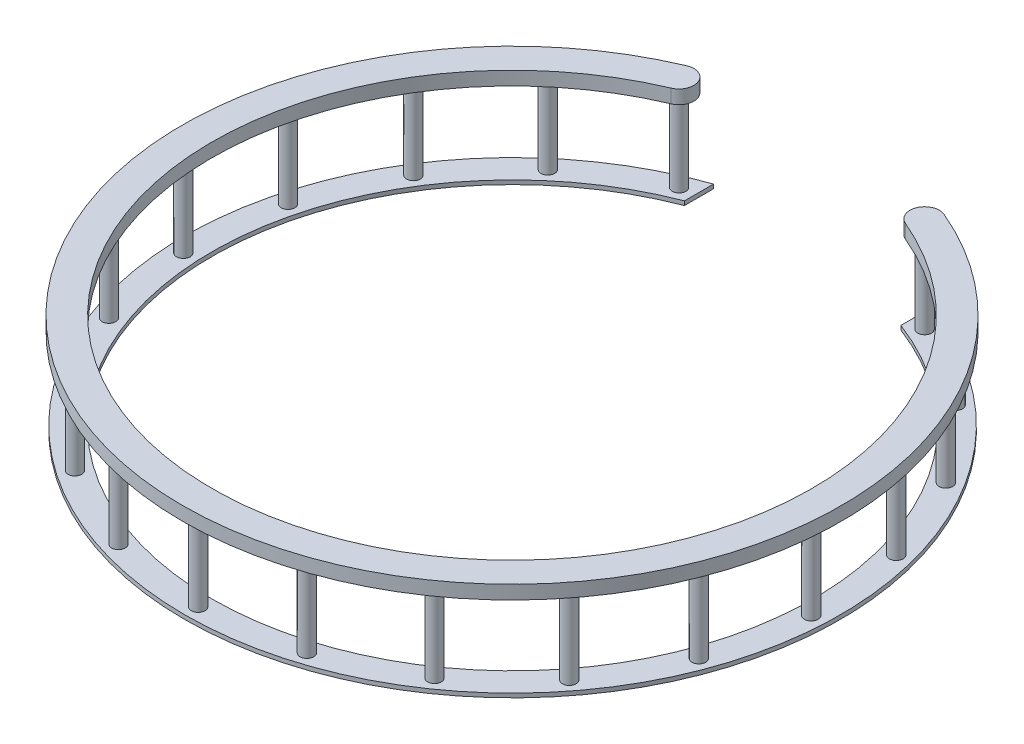
ISO-10303-21;
HEADER;
FILE_DESCRIPTION(('STEP AP214'),'2;1');
FILE_NAME('part.step','',(''),(''),'','','');
FILE_SCHEMA(('AUTOMOTIVE_DESIGN { 1 0 10303 214 1 1 1 1 }'));
ENDSEC;
DATA;
#1=APPLICATION_CONTEXT('core data for automotive mechanical design processes');
#2=APPLICATION_PROTOCOL_DEFINITION('international standard','automotive_design',2000,#1);
#3=PRODUCT_CONTEXT('',#1,'mechanical');
#4=PRODUCT('Part','Part','',(#3));
#5=PRODUCT_RELATED_PRODUCT_CATEGORY('part','',(#4));
#6=PRODUCT_DEFINITION_FORMATION('','',#4);
#7=PRODUCT_DEFINITION_CONTEXT('part definition',#1,'design');
#8=PRODUCT_DEFINITION('design','',#6,#7);
#9=PRODUCT_DEFINITION_SHAPE('','',#8);
#10=(LENGTH_UNIT() NAMED_UNIT(*) SI_UNIT(.MILLI.,.METRE.));
#11=(NAMED_UNIT(*) PLANE_ANGLE_UNIT() SI_UNIT($,.RADIAN.));
#12=(NAMED_UNIT(*) SI_UNIT($,.STERADIAN.) SOLID_ANGLE_UNIT());
#13=UNCERTAINTY_MEASURE_WITH_UNIT(LENGTH_MEASURE(1.E-05),#10,'distance_accuracy_value','');
#14=(GEOMETRIC_REPRESENTATION_CONTEXT(3) GLOBAL_UNCERTAINTY_ASSIGNED_CONTEXT((#13)) GLOBAL_UNIT_ASSIGNED_CONTEXT((#10,
#11,#12)) REPRESENTATION_CONTEXT('',''));
#15=CARTESIAN_POINT('',(0.,0.,0.));
#16=DIRECTION('',(0.,0.,1.));
#17=DIRECTION('',(1.,0.,0.));
#18=AXIS2_PLACEMENT_3D('',#15,#16,#17);
#19=CARTESIAN_POINT('',(0.,150.,0.));
#20=DIRECTION('',(0.,-1.,0.));
#21=DIRECTION('',(0.,0.,-1.));
#22=AXIS2_PLACEMENT_3D('',#19,#20,#21);
#23=CYLINDRICAL_SURFACE('',#22,12000.);
#24=CARTESIAN_POINT('',(0.,150.,0.));
#25=DIRECTION('',(0.,1.,0.));
#26=DIRECTION('',(0.,0.,1.));
#27=AXIS2_PLACEMENT_3D('',#24,#25,#26);
#28=CIRCLE('',#27,12000.);
#29=CARTESIAN_POINT('',(-3968.62696659689,150.,-11324.7516529061));
#30=VERTEX_POINT('',#29);
#31=CARTESIAN_POINT('',(3936.45053969156,150.,-11335.9762327098));
#32=VERTEX_POINT('',#31);
#33=EDGE_CURVE('E323',#30,#32,#28,.T.);
#34=ORIENTED_EDGE('',*,*,#33,.F.);
#35=DIRECTION('',(0.,-1.,0.));
#36=VECTOR('',#35,1.);
#37=CARTESIAN_POINT('',(-3968.62696659689,150.,-11324.7516529061));
#38=LINE('',#37,#36);
#39=CARTESIAN_POINT('',(-3968.62696659689,0.,-11324.7516529061));
#40=VERTEX_POINT('',#39);
#41=EDGE_CURVE('E162',#30,#40,#38,.T.);
#42=ORIENTED_EDGE('',*,*,#41,.T.);
#43=CARTESIAN_POINT('',(0.,0.,0.));
#44=DIRECTION('',(0.,1.,0.));
#45=DIRECTION('',(0.,0.,1.));
#46=AXIS2_PLACEMENT_3D('',#43,#44,#45);
#47=CIRCLE('',#46,12000.);
#48=CARTESIAN_POINT('',(3936.45053969156,0.,-11335.9762327098));
#49=VERTEX_POINT('',#48);
#50=EDGE_CURVE('E327',#40,#49,#47,.T.);
#51=ORIENTED_EDGE('',*,*,#50,.T.);
#52=DIRECTION('',(0.,-1.,0.));
#53=VECTOR('',#52,1.);
#54=CARTESIAN_POINT('',(3936.45053969156,150.,-11335.9762327098));
#55=LINE('',#54,#53);
#56=EDGE_CURVE('E152',#49,#32,#55,.F.);
#57=ORIENTED_EDGE('',*,*,#56,.T.);
#58=EDGE_LOOP('',(#34,#42,#51,#57));
#59=FACE_BOUND('',#58,.T.);
#60=ADVANCED_FACE('F49',(#59),#23,.T.);
#61=CARTESIAN_POINT('',(0.,150.,0.));
#62=DIRECTION('',(0.,1.,0.));
#63=DIRECTION('',(0.,0.,1.));
#64=AXIS2_PLACEMENT_3D('',#61,#62,#63);
#65=PLANE('',#64);
#66=DIRECTION('',(0.,0.,1.));
#67=VECTOR('',#66,1.);
#68=CARTESIAN_POINT('',(-3968.62696659689,150.,0.));
#69=LINE('',#68,#67);
#70=CARTESIAN_POINT('',(-3968.62696659689,150.,-10259.1422643416));
#71=VERTEX_POINT('',#70);
#72=EDGE_CURVE('E72',#30,#71,#69,.T.);
#73=ORIENTED_EDGE('',*,*,#72,.F.);
#74=ORIENTED_EDGE('',*,*,#33,.T.);
#75=DIRECTION('',(0.,0.,-1.));
#76=VECTOR('',#75,1.);
#77=CARTESIAN_POINT('',(3936.45053969156,150.,0.));
#78=LINE('',#77,#76);
#79=CARTESIAN_POINT('',(3936.45053969156,150.,-10271.5313925705));
#80=VERTEX_POINT('',#79);
#81=EDGE_CURVE('E144',#80,#32,#78,.T.);
#82=ORIENTED_EDGE('',*,*,#81,.F.);
#83=CARTESIAN_POINT('',(0.,150.,0.));
#84=DIRECTION('',(0.,1.,0.));
#85=DIRECTION('',(0.,0.,1.));
#86=AXIS2_PLACEMENT_3D('',#83,#84,#85);
#87=CIRCLE('',#86,11000.);
#88=EDGE_CURVE('E315',#71,#80,#87,.T.);
#89=ORIENTED_EDGE('',*,*,#88,.F.);
#90=EDGE_LOOP('',(#73,#74,#82,#89));
#91=FACE_BOUND('',#90,.T.);
#92=CARTESIAN_POINT('',(3447.48044475495,150.,10971.0928618361));
#93=DIRECTION('',(0.,1.,0.));
#94=DIRECTION('',(0.299780908239561,0.,0.954008074942274));
#95=AXIS2_PLACEMENT_3D('',#92,#93,#94);
#96=CIRCLE('',#95,250.);
#97=CARTESIAN_POINT('',(3522.42567181484,150.,11209.5948805717));
#98=VERTEX_POINT('',#97);
#99=EDGE_CURVE('E167',#98,#98,#96,.T.);
#100=ORIENTED_EDGE('',*,*,#99,.F.);
#101=EDGE_LOOP('',(#100));
#102=FACE_BOUND('',#101,.T.);
#103=CARTESIAN_POINT('',(6577.84836500361,150.,9433.02236226646));
#104=DIRECTION('',(0.,1.,0.));
#105=DIRECTION('',(0.57198681434814,0.,0.820262814110128));
#106=AXIS2_PLACEMENT_3D('',#103,#104,#105);
#107=CIRCLE('',#106,250.);
#108=CARTESIAN_POINT('',(6720.84506859064,150.,9638.088065794));
#109=VERTEX_POINT('',#108);
#110=EDGE_CURVE('E177',#109,#109,#107,.T.);
#111=ORIENTED_EDGE('',*,*,#110,.F.);
#112=EDGE_LOOP('',(#111));
#113=FACE_BOUND('',#112,.T.);
#114=CARTESIAN_POINT('',(9103.16046716361,150.,7027.26614759036));
#115=DIRECTION('',(0.,1.,0.));
#116=DIRECTION('',(0.791579171057706,0.,0.611066621529597));
#117=AXIS2_PLACEMENT_3D('',#114,#115,#116);
#118=CIRCLE('',#117,250.);
#119=CARTESIAN_POINT('',(9301.05525992804,150.,7180.03280297276));
#120=VERTEX_POINT('',#119);
#121=EDGE_CURVE('E185',#120,#120,#118,.T.);
#122=ORIENTED_EDGE('',*,*,#121,.F.);
#123=EDGE_LOOP('',(#122));
#124=FACE_BOUND('',#123,.T.);
#125=CARTESIAN_POINT('',(10791.1288213351,150.,3975.11493687292));
#126=DIRECTION('',(0.,1.,0.));
#127=DIRECTION('',(0.938359027942186,0.,0.345662168423732));
#128=AXIS2_PLACEMENT_3D('',#125,#126,#127);
#129=CIRCLE('',#128,250.);
#130=CARTESIAN_POINT('',(11025.7185783207,150.,4061.53047897885));
#131=VERTEX_POINT('',#130);
#132=EDGE_CURVE('E193',#131,#131,#129,.T.);
#133=ORIENTED_EDGE('',*,*,#132,.F.);
#134=EDGE_LOOP('',(#133));
#135=FACE_BOUND('',#134,.T.);
#136=CARTESIAN_POINT('',(11486.4875994284,150.,557.317349610463));
#137=DIRECTION('',(0.,1.,0.));
#138=DIRECTION('',(0.998825008645951,0.,0.0484623782269967));
#139=AXIS2_PLACEMENT_3D('',#136,#137,#138);
#140=CIRCLE('',#139,250.);
#141=CARTESIAN_POINT('',(11736.1938515899,150.,569.432944167212));
#142=VERTEX_POINT('',#141);
#143=EDGE_CURVE('E201',#142,#142,#140,.T.);
#144=ORIENTED_EDGE('',*,*,#143,.F.);
#145=EDGE_LOOP('',(#144));
#146=FACE_BOUND('',#145,.T.);
#147=CARTESIAN_POINT('',(11125.2750238229,150.,-2911.7444332053));
#148=DIRECTION('',(0.,1.,0.));
#149=DIRECTION('',(0.967415219462862,0.,-0.253195168104809));
#150=AXIS2_PLACEMENT_3D('',#147,#148,#149);
#151=CIRCLE('',#150,250.);
#152=CARTESIAN_POINT('',(11367.1288286886,150.,-2975.0432252315));
#153=VERTEX_POINT('',#152);
#154=EDGE_CURVE('E209',#153,#153,#151,.T.);
#155=ORIENTED_EDGE('',*,*,#154,.F.);
#156=EDGE_LOOP('',(#155));
#157=FACE_BOUND('',#156,.T.);
#158=CARTESIAN_POINT('',(9740.71681793288,150.,-6112.97275250261));
#159=DIRECTION('',(0.,1.,0.));
#160=DIRECTION('',(0.847018853733295,0.,-0.531562848043705));
#161=AXIS2_PLACEMENT_3D('',#158,#159,#160);
#162=CIRCLE('',#161,250.);
#163=CARTESIAN_POINT('',(9952.47153136621,150.,-6245.86346451353));
#164=VERTEX_POINT('',#163);
#165=EDGE_CURVE('E217',#164,#164,#162,.T.);
#166=ORIENTED_EDGE('',*,*,#165,.F.);
#167=EDGE_LOOP('',(#166));
#168=FACE_BOUND('',#167,.T.);
#169=CARTESIAN_POINT('',(7460.16997624506,150.,-8751.90630237387));
#170=DIRECTION('',(0.,1.,0.));
#171=DIRECTION('',(0.648710432716962,0.,-0.761035330641207));
#172=AXIS2_PLACEMENT_3D('',#169,#170,#171);
#173=CIRCLE('',#172,250.);
#174=CARTESIAN_POINT('',(7622.3475844243,150.,-8942.16513503418));
#175=VERTEX_POINT('',#174);
#176=EDGE_CURVE('E225',#175,#175,#173,.T.);
#177=ORIENTED_EDGE('',*,*,#176,.F.);
#178=EDGE_LOOP('',(#177));
#179=FACE_BOUND('',#178,.T.);
#180=CARTESIAN_POINT('',(4493.40797762652,150.,-10585.8058147031));
#181=DIRECTION('',(0.,1.,0.));
#182=DIRECTION('',(0.390731128489263,0.,-0.920504853452445));
#183=AXIS2_PLACEMENT_3D('',#180,#181,#182);
#184=CIRCLE('',#183,250.);
#185=CARTESIAN_POINT('',(4591.09075974884,150.,-10815.9320280662));
#186=VERTEX_POINT('',#185);
#187=EDGE_CURVE('E166',#186,#186,#184,.T.);
#188=ORIENTED_EDGE('',*,*,#187,.F.);
#189=EDGE_LOOP('',(#188));
#190=FACE_BOUND('',#189,.T.);
#191=CARTESIAN_POINT('',(-3447.48044475495,150.,10971.0928618361));
#192=DIRECTION('',(0.,1.,0.));
#193=DIRECTION('',(-0.299780908239561,0.,0.954008074942274));
#194=AXIS2_PLACEMENT_3D('',#191,#192,#193);
#195=CIRCLE('',#194,250.);
#196=CARTESIAN_POINT('',(-3522.42567181484,150.,11209.5948805717));
#197=VERTEX_POINT('',#196);
#198=EDGE_CURVE('E239',#197,#197,#195,.T.);
#199=ORIENTED_EDGE('',*,*,#198,.F.);
#200=EDGE_LOOP('',(#199));
#201=FACE_BOUND('',#200,.T.);
#202=CARTESIAN_POINT('',(-6577.84836500361,150.,9433.02236226646));
#203=DIRECTION('',(0.,1.,0.));
#204=DIRECTION('',(-0.57198681434814,0.,0.820262814110128));
#205=AXIS2_PLACEMENT_3D('',#202,#203,#204);
#206=CIRCLE('',#205,250.);
#207=CARTESIAN_POINT('',(-6720.84506859064,150.,9638.088065794));
#208=VERTEX_POINT('',#207);
#209=EDGE_CURVE('E249',#208,#208,#206,.T.);
#210=ORIENTED_EDGE('',*,*,#209,.F.);
#211=EDGE_LOOP('',(#210));
#212=FACE_BOUND('',#211,.T.);
#213=CARTESIAN_POINT('',(-9103.16046716361,150.,7027.26614759036));
#214=DIRECTION('',(0.,1.,0.));
#215=DIRECTION('',(-0.791579171057706,0.,0.611066621529597));
#216=AXIS2_PLACEMENT_3D('',#213,#214,#215);
#217=CIRCLE('',#216,250.);
#218=CARTESIAN_POINT('',(-9301.05525992804,150.,7180.03280297276));
#219=VERTEX_POINT('',#218);
#220=EDGE_CURVE('E257',#219,#219,#217,.T.);
#221=ORIENTED_EDGE('',*,*,#220,.F.);
#222=EDGE_LOOP('',(#221));
#223=FACE_BOUND('',#222,.T.);
#224=CARTESIAN_POINT('',(-10791.1288213351,150.,3975.11493687291));
#225=DIRECTION('',(0.,1.,0.));
#226=DIRECTION('',(-0.938359027942186,0.,0.345662168423732));
#227=AXIS2_PLACEMENT_3D('',#224,#225,#226);
#228=CIRCLE('',#227,250.);
#229=CARTESIAN_POINT('',(-11025.7185783207,150.,4061.53047897885));
#230=VERTEX_POINT('',#229);
#231=EDGE_CURVE('E265',#230,#230,#228,.T.);
#232=ORIENTED_EDGE('',*,*,#231,.F.);
#233=EDGE_LOOP('',(#232));
#234=FACE_BOUND('',#233,.T.);
#235=CARTESIAN_POINT('',(-11486.4875994284,150.,557.317349610461));
#236=DIRECTION('',(0.,1.,0.));
#237=DIRECTION('',(-0.998825008645951,0.,0.0484623782269967));
#238=AXIS2_PLACEMENT_3D('',#235,#236,#237);
#239=CIRCLE('',#238,250.);
#240=CARTESIAN_POINT('',(-11736.1938515899,150.,569.43294416721));
#241=VERTEX_POINT('',#240);
#242=EDGE_CURVE('E273',#241,#241,#239,.T.);
#243=ORIENTED_EDGE('',*,*,#242,.F.);
#244=EDGE_LOOP('',(#243));
#245=FACE_BOUND('',#244,.T.);
#246=CARTESIAN_POINT('',(-11125.2750238229,150.,-2911.7444332053));
#247=DIRECTION('',(0.,1.,0.));
#248=DIRECTION('',(-0.967415219462862,0.,-0.253195168104809));
#249=AXIS2_PLACEMENT_3D('',#246,#247,#248);
#250=CIRCLE('',#249,250.);
#251=CARTESIAN_POINT('',(-11367.1288286886,150.,-2975.04322523151));
#252=VERTEX_POINT('',#251);
#253=EDGE_CURVE('E281',#252,#252,#250,.T.);
#254=ORIENTED_EDGE('',*,*,#253,.F.);
#255=EDGE_LOOP('',(#254));
#256=FACE_BOUND('',#255,.T.);
#257=CARTESIAN_POINT('',(-9740.71681793288,150.,-6112.97275250261));
#258=DIRECTION('',(0.,1.,0.));
#259=DIRECTION('',(-0.847018853733295,0.,-0.531562848043705));
#260=AXIS2_PLACEMENT_3D('',#257,#258,#259);
#261=CIRCLE('',#260,250.);
#262=CARTESIAN_POINT('',(-9952.47153136621,150.,-6245.86346451353));
#263=VERTEX_POINT('',#262);
#264=EDGE_CURVE('E289',#263,#263,#261,.T.);
#265=ORIENTED_EDGE('',*,*,#264,.F.);
#266=EDGE_LOOP('',(#265));
#267=FACE_BOUND('',#266,.T.);
#268=CARTESIAN_POINT('',(-7460.16997624506,150.,-8751.90630237387));
#269=DIRECTION('',(0.,1.,0.));
#270=DIRECTION('',(-0.648710432716962,0.,-0.761035330641207));
#271=AXIS2_PLACEMENT_3D('',#268,#269,#270);
#272=CIRCLE('',#271,250.);
#273=CARTESIAN_POINT('',(-7622.3475844243,150.,-8942.16513503418));
#274=VERTEX_POINT('',#273);
#275=EDGE_CURVE('E297',#274,#274,#272,.T.);
#276=ORIENTED_EDGE('',*,*,#275,.F.);
#277=EDGE_LOOP('',(#276));
#278=FACE_BOUND('',#277,.T.);
#279=CARTESIAN_POINT('',(-4493.40797762652,150.,-10585.8058147031));
#280=DIRECTION('',(0.,1.,0.));
#281=DIRECTION('',(-0.390731128489263,0.,-0.920504853452445));
#282=AXIS2_PLACEMENT_3D('',#279,#280,#281);
#283=CIRCLE('',#282,250.);
#284=CARTESIAN_POINT('',(-4591.09075974884,150.,-10815.9320280662));
#285=VERTEX_POINT('',#284);
#286=EDGE_CURVE('E176',#285,#285,#283,.T.);
#287=ORIENTED_EDGE('',*,*,#286,.F.);
#288=EDGE_LOOP('',(#287));
#289=FACE_BOUND('',#288,.T.);
#290=CARTESIAN_POINT('',(-1.01033360929657E-12,150.,11500.));
#291=DIRECTION('',(0.,1.,0.));
#292=DIRECTION('',(0.,0.,1.));
#293=AXIS2_PLACEMENT_3D('',#290,#291,#292);
#294=CIRCLE('',#293,250.);
#295=CARTESIAN_POINT('',(-1.01033360929657E-12,150.,11750.));
#296=VERTEX_POINT('',#295);
#297=EDGE_CURVE('E248',#296,#296,#294,.T.);
#298=ORIENTED_EDGE('',*,*,#297,.F.);
#299=EDGE_LOOP('',(#298));
#300=FACE_BOUND('',#299,.T.);
#301=ADVANCED_FACE('F346',(#91,#102,#113,#124,#135,#146,#157,#168,#179,#190,#201,#212,#223,#234,
#245,#256,#267,#278,#289,#300),#65,.T.);
#302=CARTESIAN_POINT('',(0.,0.,0.));
#303=DIRECTION('',(0.,1.,0.));
#304=DIRECTION('',(0.,0.,1.));
#305=AXIS2_PLACEMENT_3D('',#302,#303,#304);
#306=PLANE('',#305);
#307=ORIENTED_EDGE('',*,*,#50,.F.);
#308=DIRECTION('',(0.,0.,1.));
#309=VECTOR('',#308,1.);
#310=CARTESIAN_POINT('',(-3968.62696659689,0.,0.));
#311=LINE('',#310,#309);
#312=CARTESIAN_POINT('',(-3968.62696659689,0.,-10259.1422643416));
#313=VERTEX_POINT('',#312);
#314=EDGE_CURVE('E156',#40,#313,#311,.T.);
#315=ORIENTED_EDGE('',*,*,#314,.T.);
#316=CARTESIAN_POINT('',(0.,0.,0.));
#317=DIRECTION('',(0.,1.,0.));
#318=DIRECTION('',(0.,0.,1.));
#319=AXIS2_PLACEMENT_3D('',#316,#317,#318);
#320=CIRCLE('',#319,11000.);
#321=CARTESIAN_POINT('',(3936.45053969156,0.,-10271.5313925705));
#322=VERTEX_POINT('',#321);
#323=EDGE_CURVE('E322',#313,#322,#320,.T.);
#324=ORIENTED_EDGE('',*,*,#323,.T.);
#325=DIRECTION('',(0.,0.,-1.));
#326=VECTOR('',#325,1.);
#327=CARTESIAN_POINT('',(3936.45053969156,0.,0.));
#328=LINE('',#327,#326);
#329=EDGE_CURVE('E64',#322,#49,#328,.T.);
#330=ORIENTED_EDGE('',*,*,#329,.T.);
#331=EDGE_LOOP('',(#307,#315,#324,#330));
#332=FACE_BOUND('',#331,.T.);
#333=ADVANCED_FACE('F341',(#332),#306,.F.);
#334=CARTESIAN_POINT('',(0.,-1850.,0.));
#335=DIRECTION('',(0.,1.,0.));
#336=DIRECTION('',(0.,0.,1.));
#337=AXIS2_PLACEMENT_3D('',#334,#335,#336);
#338=CYLINDRICAL_SURFACE('',#337,11000.);
#339=ORIENTED_EDGE('',*,*,#323,.F.);
#340=DIRECTION('',(0.,1.,0.));
#341=VECTOR('',#340,1.);
#342=CARTESIAN_POINT('',(-3968.62696659689,-1850.,-10259.1422643416));
#343=LINE('',#342,#341);
#344=EDGE_CURVE('E11',#313,#71,#343,.T.);
#345=ORIENTED_EDGE('',*,*,#344,.T.);
#346=ORIENTED_EDGE('',*,*,#88,.T.);
#347=DIRECTION('',(0.,1.,0.));
#348=VECTOR('',#347,1.);
#349=CARTESIAN_POINT('',(3936.45053969156,-1850.,-10271.5313925705));
#350=LINE('',#349,#348);
#351=EDGE_CURVE('E57',#80,#322,#350,.F.);
#352=ORIENTED_EDGE('',*,*,#351,.T.);
#353=EDGE_LOOP('',(#339,#345,#346,#352));
#354=FACE_BOUND('',#353,.T.);
#355=ADVANCED_FACE('F336',(#354),#338,.F.);
#356=CARTESIAN_POINT('',(-1.01033360929657E-12,3150.,11500.));
#357=DIRECTION('',(0.,-1.,0.));
#358=DIRECTION('',(0.,0.,-1.));
#359=AXIS2_PLACEMENT_3D('',#356,#357,#358);
#360=CYLINDRICAL_SURFACE('',#359,250.);
#361=CARTESIAN_POINT('',(-1.01033360929657E-12,3150.,11500.));
#362=DIRECTION('',(0.,1.,0.));
#363=DIRECTION('',(0.,0.,1.));
#364=AXIS2_PLACEMENT_3D('',#361,#362,#363);
#365=CIRCLE('',#364,250.);
#366=CARTESIAN_POINT('',(-1.01033360929657E-12,3150.,11750.));
#367=VERTEX_POINT('',#366);
#368=EDGE_CURVE('E311',#367,#367,#365,.T.);
#369=ORIENTED_EDGE('',*,*,#368,.F.);
#370=EDGE_LOOP('',(#369));
#371=FACE_BOUND('',#370,.T.);
#372=ORIENTED_EDGE('',*,*,#297,.T.);
#373=EDGE_LOOP('',(#372));
#374=FACE_BOUND('',#373,.T.);
#375=ADVANCED_FACE('F372',(#371,#374),#360,.T.);
#376=CARTESIAN_POINT('',(-4493.40797762652,3150.,-10585.8058147031));
#377=DIRECTION('',(0.,-1.,0.));
#378=DIRECTION('',(0.390731128489263,0.,0.920504853452445));
#379=AXIS2_PLACEMENT_3D('',#376,#377,#378);
#380=CYLINDRICAL_SURFACE('',#379,250.);
#381=CARTESIAN_POINT('',(-4493.40797762652,3150.,-10585.8058147031));
#382=DIRECTION('',(0.,1.,0.));
#383=DIRECTION('',(-0.390731128489263,0.,-0.920504853452445));
#384=AXIS2_PLACEMENT_3D('',#381,#382,#383);
#385=CIRCLE('',#384,250.);
#386=CARTESIAN_POINT('',(-4591.09075974884,3150.,-10815.9320280662));
#387=VERTEX_POINT('',#386);
#388=EDGE_CURVE('E301',#387,#387,#385,.T.);
#389=ORIENTED_EDGE('',*,*,#388,.F.);
#390=EDGE_LOOP('',(#389));
#391=FACE_BOUND('',#390,.T.);
#392=ORIENTED_EDGE('',*,*,#286,.T.);
#393=EDGE_LOOP('',(#392));
#394=FACE_BOUND('',#393,.T.);
#395=ADVANCED_FACE('F375',(#391,#394),#380,.T.);
#396=CARTESIAN_POINT('',(-7460.16997624506,3150.,-8751.90630237387));
#397=DIRECTION('',(0.,-1.,0.));
#398=DIRECTION('',(0.648710432716962,0.,0.761035330641207));
#399=AXIS2_PLACEMENT_3D('',#396,#397,#398);
#400=CYLINDRICAL_SURFACE('',#399,250.);
#401=CARTESIAN_POINT('',(-7460.16997624506,3150.,-8751.90630237387));
#402=DIRECTION('',(0.,1.,0.));
#403=DIRECTION('',(-0.648710432716962,0.,-0.761035330641207));
#404=AXIS2_PLACEMENT_3D('',#401,#402,#403);
#405=CIRCLE('',#404,250.);
#406=CARTESIAN_POINT('',(-7622.3475844243,3150.,-8942.16513503418));
#407=VERTEX_POINT('',#406);
#408=EDGE_CURVE('E293',#407,#407,#405,.T.);
#409=ORIENTED_EDGE('',*,*,#408,.F.);
#410=EDGE_LOOP('',(#409));
#411=FACE_BOUND('',#410,.T.);
#412=ORIENTED_EDGE('',*,*,#275,.T.);
#413=EDGE_LOOP('',(#412));
#414=FACE_BOUND('',#413,.T.);
#415=ADVANCED_FACE('F379',(#411,#414),#400,.T.);
#416=CARTESIAN_POINT('',(-9740.71681793288,3150.,-6112.97275250261));
#417=DIRECTION('',(0.,-1.,0.));
#418=DIRECTION('',(0.847018853733295,0.,0.531562848043705));
#419=AXIS2_PLACEMENT_3D('',#416,#417,#418);
#420=CYLINDRICAL_SURFACE('',#419,250.);
#421=CARTESIAN_POINT('',(-9740.71681793288,3150.,-6112.97275250261));
#422=DIRECTION('',(0.,1.,0.));
#423=DIRECTION('',(-0.847018853733295,0.,-0.531562848043705));
#424=AXIS2_PLACEMENT_3D('',#421,#422,#423);
#425=CIRCLE('',#424,250.);
#426=CARTESIAN_POINT('',(-9952.47153136621,3150.,-6245.86346451353));
#427=VERTEX_POINT('',#426);
#428=EDGE_CURVE('E285',#427,#427,#425,.T.);
#429=ORIENTED_EDGE('',*,*,#428,.F.);
#430=EDGE_LOOP('',(#429));
#431=FACE_BOUND('',#430,.T.);
#432=ORIENTED_EDGE('',*,*,#264,.T.);
#433=EDGE_LOOP('',(#432));
#434=FACE_BOUND('',#433,.T.);
#435=ADVANCED_FACE('F383',(#431,#434),#420,.T.);
#436=CARTESIAN_POINT('',(-11125.2750238229,3150.,-2911.7444332053));
#437=DIRECTION('',(0.,-1.,0.));
#438=DIRECTION('',(0.967415219462862,0.,0.253195168104809));
#439=AXIS2_PLACEMENT_3D('',#436,#437,#438);
#440=CYLINDRICAL_SURFACE('',#439,250.);
#441=CARTESIAN_POINT('',(-11125.2750238229,3150.,-2911.7444332053));
#442=DIRECTION('',(0.,1.,0.));
#443=DIRECTION('',(-0.967415219462862,0.,-0.253195168104809));
#444=AXIS2_PLACEMENT_3D('',#441,#442,#443);
#445=CIRCLE('',#444,250.);
#446=CARTESIAN_POINT('',(-11367.1288286886,3150.,-2975.04322523151));
#447=VERTEX_POINT('',#446);
#448=EDGE_CURVE('E277',#447,#447,#445,.T.);
#449=ORIENTED_EDGE('',*,*,#448,.F.);
#450=EDGE_LOOP('',(#449));
#451=FACE_BOUND('',#450,.T.);
#452=ORIENTED_EDGE('',*,*,#253,.T.);
#453=EDGE_LOOP('',(#452));
#454=FACE_BOUND('',#453,.T.);
#455=ADVANCED_FACE('F387',(#451,#454),#440,.T.);
#456=CARTESIAN_POINT('',(-11486.4875994284,3150.,557.317349610461));
#457=DIRECTION('',(0.,-1.,0.));
#458=DIRECTION('',(0.998825008645951,0.,-0.0484623782269967));
#459=AXIS2_PLACEMENT_3D('',#456,#457,#458);
#460=CYLINDRICAL_SURFACE('',#459,250.);
#461=CARTESIAN_POINT('',(-11486.4875994284,3150.,557.317349610461));
#462=DIRECTION('',(0.,1.,0.));
#463=DIRECTION('',(-0.998825008645951,0.,0.0484623782269967));
#464=AXIS2_PLACEMENT_3D('',#461,#462,#463);
#465=CIRCLE('',#464,250.);
#466=CARTESIAN_POINT('',(-11736.1938515899,3150.,569.43294416721));
#467=VERTEX_POINT('',#466);
#468=EDGE_CURVE('E269',#467,#467,#465,.T.);
#469=ORIENTED_EDGE('',*,*,#468,.F.);
#470=EDGE_LOOP('',(#469));
#471=FACE_BOUND('',#470,.T.);
#472=ORIENTED_EDGE('',*,*,#242,.T.);
#473=EDGE_LOOP('',(#472));
#474=FACE_BOUND('',#473,.T.);
#475=ADVANCED_FACE('F391',(#471,#474),#460,.T.);
#476=CARTESIAN_POINT('',(-10791.1288213351,3150.,3975.11493687291));
#477=DIRECTION('',(0.,-1.,0.));
#478=DIRECTION('',(0.938359027942186,0.,-0.345662168423732));
#479=AXIS2_PLACEMENT_3D('',#476,#477,#478);
#480=CYLINDRICAL_SURFACE('',#479,250.);
#481=CARTESIAN_POINT('',(-10791.1288213351,3150.,3975.11493687291));
#482=DIRECTION('',(0.,1.,0.));
#483=DIRECTION('',(-0.938359027942186,0.,0.345662168423732));
#484=AXIS2_PLACEMENT_3D('',#481,#482,#483);
#485=CIRCLE('',#484,250.);
#486=CARTESIAN_POINT('',(-11025.7185783207,3150.,4061.53047897885));
#487=VERTEX_POINT('',#486);
#488=EDGE_CURVE('E261',#487,#487,#485,.T.);
#489=ORIENTED_EDGE('',*,*,#488,.F.);
#490=EDGE_LOOP('',(#489));
#491=FACE_BOUND('',#490,.T.);
#492=ORIENTED_EDGE('',*,*,#231,.T.);
#493=EDGE_LOOP('',(#492));
#494=FACE_BOUND('',#493,.T.);
#495=ADVANCED_FACE('F395',(#491,#494),#480,.T.);
#496=CARTESIAN_POINT('',(-9103.16046716361,3150.,7027.26614759036));
#497=DIRECTION('',(0.,-1.,0.));
#498=DIRECTION('',(0.791579171057706,0.,-0.611066621529597));
#499=AXIS2_PLACEMENT_3D('',#496,#497,#498);
#500=CYLINDRICAL_SURFACE('',#499,250.);
#501=CARTESIAN_POINT('',(-9103.16046716361,3150.,7027.26614759036));
#502=DIRECTION('',(0.,1.,0.));
#503=DIRECTION('',(-0.791579171057706,0.,0.611066621529597));
#504=AXIS2_PLACEMENT_3D('',#501,#502,#503);
#505=CIRCLE('',#504,250.);
#506=CARTESIAN_POINT('',(-9301.05525992804,3150.,7180.03280297276));
#507=VERTEX_POINT('',#506);
#508=EDGE_CURVE('E253',#507,#507,#505,.T.);
#509=ORIENTED_EDGE('',*,*,#508,.F.);
#510=EDGE_LOOP('',(#509));
#511=FACE_BOUND('',#510,.T.);
#512=ORIENTED_EDGE('',*,*,#220,.T.);
#513=EDGE_LOOP('',(#512));
#514=FACE_BOUND('',#513,.T.);
#515=ADVANCED_FACE('F399',(#511,#514),#500,.T.);
#516=CARTESIAN_POINT('',(-6577.84836500361,3150.,9433.02236226646));
#517=DIRECTION('',(0.,-1.,0.));
#518=DIRECTION('',(0.57198681434814,0.,-0.820262814110128));
#519=AXIS2_PLACEMENT_3D('',#516,#517,#518);
#520=CYLINDRICAL_SURFACE('',#519,250.);
#521=CARTESIAN_POINT('',(-6577.84836500361,3150.,9433.02236226646));
#522=DIRECTION('',(0.,1.,0.));
#523=DIRECTION('',(-0.57198681434814,0.,0.820262814110128));
#524=AXIS2_PLACEMENT_3D('',#521,#522,#523);
#525=CIRCLE('',#524,250.);
#526=CARTESIAN_POINT('',(-6720.84506859064,3150.,9638.088065794));
#527=VERTEX_POINT('',#526);
#528=EDGE_CURVE('E244',#527,#527,#525,.T.);
#529=ORIENTED_EDGE('',*,*,#528,.F.);
#530=EDGE_LOOP('',(#529));
#531=FACE_BOUND('',#530,.T.);
#532=ORIENTED_EDGE('',*,*,#209,.T.);
#533=EDGE_LOOP('',(#532));
#534=FACE_BOUND('',#533,.T.);
#535=ADVANCED_FACE('F403',(#531,#534),#520,.T.);
#536=CARTESIAN_POINT('',(-3447.48044475495,3150.,10971.0928618361));
#537=DIRECTION('',(0.,-1.,0.));
#538=DIRECTION('',(0.299780908239561,0.,-0.954008074942274));
#539=AXIS2_PLACEMENT_3D('',#536,#537,#538);
#540=CYLINDRICAL_SURFACE('',#539,250.);
#541=CARTESIAN_POINT('',(-3447.48044475495,3150.,10971.0928618361));
#542=DIRECTION('',(0.,1.,0.));
#543=DIRECTION('',(-0.299780908239561,0.,0.954008074942274));
#544=AXIS2_PLACEMENT_3D('',#541,#542,#543);
#545=CIRCLE('',#544,250.);
#546=CARTESIAN_POINT('',(-3522.42567181484,3150.,11209.5948805717));
#547=VERTEX_POINT('',#546);
#548=EDGE_CURVE('E243',#547,#547,#545,.T.);
#549=ORIENTED_EDGE('',*,*,#548,.F.);
#550=EDGE_LOOP('',(#549));
#551=FACE_BOUND('',#550,.T.);
#552=ORIENTED_EDGE('',*,*,#198,.T.);
#553=EDGE_LOOP('',(#552));
#554=FACE_BOUND('',#553,.T.);
#555=ADVANCED_FACE('F407',(#551,#554),#540,.T.);
#556=CARTESIAN_POINT('',(4493.40797762652,3150.,-10585.8058147031));
#557=DIRECTION('',(0.,-1.,0.));
#558=DIRECTION('',(-0.390731128489263,0.,0.920504853452445));
#559=AXIS2_PLACEMENT_3D('',#556,#557,#558);
#560=CYLINDRICAL_SURFACE('',#559,250.);
#561=CARTESIAN_POINT('',(4493.40797762652,3150.,-10585.8058147031));
#562=DIRECTION('',(0.,1.,0.));
#563=DIRECTION('',(0.390731128489263,0.,-0.920504853452445));
#564=AXIS2_PLACEMENT_3D('',#561,#562,#563);
#565=CIRCLE('',#564,250.);
#566=CARTESIAN_POINT('',(4591.09075974884,3150.,-10815.9320280662));
#567=VERTEX_POINT('',#566);
#568=EDGE_CURVE('E229',#567,#567,#565,.T.);
#569=ORIENTED_EDGE('',*,*,#568,.F.);
#570=EDGE_LOOP('',(#569));
#571=FACE_BOUND('',#570,.T.);
#572=ORIENTED_EDGE('',*,*,#187,.T.);
#573=EDGE_LOOP('',(#572));
#574=FACE_BOUND('',#573,.T.);
#575=ADVANCED_FACE('F411',(#571,#574),#560,.T.);
#576=CARTESIAN_POINT('',(7460.16997624506,3150.,-8751.90630237387));
#577=DIRECTION('',(0.,-1.,0.));
#578=DIRECTION('',(-0.648710432716962,0.,0.761035330641207));
#579=AXIS2_PLACEMENT_3D('',#576,#577,#578);
#580=CYLINDRICAL_SURFACE('',#579,250.);
#581=CARTESIAN_POINT('',(7460.16997624506,3150.,-8751.90630237387));
#582=DIRECTION('',(0.,1.,0.));
#583=DIRECTION('',(0.648710432716962,0.,-0.761035330641207));
#584=AXIS2_PLACEMENT_3D('',#581,#582,#583);
#585=CIRCLE('',#584,250.);
#586=CARTESIAN_POINT('',(7622.3475844243,3150.,-8942.16513503418));
#587=VERTEX_POINT('',#586);
#588=EDGE_CURVE('E221',#587,#587,#585,.T.);
#589=ORIENTED_EDGE('',*,*,#588,.F.);
#590=EDGE_LOOP('',(#589));
#591=FACE_BOUND('',#590,.T.);
#592=ORIENTED_EDGE('',*,*,#176,.T.);
#593=EDGE_LOOP('',(#592));
#594=FACE_BOUND('',#593,.T.);
#595=ADVANCED_FACE('F415',(#591,#594),#580,.T.);
#596=CARTESIAN_POINT('',(9740.71681793288,3150.,-6112.97275250261));
#597=DIRECTION('',(0.,-1.,0.));
#598=DIRECTION('',(-0.847018853733295,0.,0.531562848043705));
#599=AXIS2_PLACEMENT_3D('',#596,#597,#598);
#600=CYLINDRICAL_SURFACE('',#599,250.);
#601=CARTESIAN_POINT('',(9740.71681793288,3150.,-6112.97275250261));
#602=DIRECTION('',(0.,1.,0.));
#603=DIRECTION('',(0.847018853733295,0.,-0.531562848043705));
#604=AXIS2_PLACEMENT_3D('',#601,#602,#603);
#605=CIRCLE('',#604,250.);
#606=CARTESIAN_POINT('',(9952.47153136621,3150.,-6245.86346451353));
#607=VERTEX_POINT('',#606);
#608=EDGE_CURVE('E213',#607,#607,#605,.T.);
#609=ORIENTED_EDGE('',*,*,#608,.F.);
#610=EDGE_LOOP('',(#609));
#611=FACE_BOUND('',#610,.T.);
#612=ORIENTED_EDGE('',*,*,#165,.T.);
#613=EDGE_LOOP('',(#612));
#614=FACE_BOUND('',#613,.T.);
#615=ADVANCED_FACE('F419',(#611,#614),#600,.T.);
#616=CARTESIAN_POINT('',(11125.2750238229,3150.,-2911.7444332053));
#617=DIRECTION('',(0.,-1.,0.));
#618=DIRECTION('',(-0.967415219462862,0.,0.253195168104809));
#619=AXIS2_PLACEMENT_3D('',#616,#617,#618);
#620=CYLINDRICAL_SURFACE('',#619,250.);
#621=CARTESIAN_POINT('',(11125.2750238229,3150.,-2911.7444332053));
#622=DIRECTION('',(0.,1.,0.));
#623=DIRECTION('',(0.967415219462862,0.,-0.253195168104809));
#624=AXIS2_PLACEMENT_3D('',#621,#622,#623);
#625=CIRCLE('',#624,250.);
#626=CARTESIAN_POINT('',(11367.1288286886,3150.,-2975.0432252315));
#627=VERTEX_POINT('',#626);
#628=EDGE_CURVE('E205',#627,#627,#625,.T.);
#629=ORIENTED_EDGE('',*,*,#628,.F.);
#630=EDGE_LOOP('',(#629));
#631=FACE_BOUND('',#630,.T.);
#632=ORIENTED_EDGE('',*,*,#154,.T.);
#633=EDGE_LOOP('',(#632));
#634=FACE_BOUND('',#633,.T.);
#635=ADVANCED_FACE('F423',(#631,#634),#620,.T.);
#636=CARTESIAN_POINT('',(11486.4875994284,3150.,557.317349610463));
#637=DIRECTION('',(0.,-1.,0.));
#638=DIRECTION('',(-0.998825008645951,0.,-0.0484623782269967));
#639=AXIS2_PLACEMENT_3D('',#636,#637,#638);
#640=CYLINDRICAL_SURFACE('',#639,250.);
#641=CARTESIAN_POINT('',(11486.4875994284,3150.,557.317349610463));
#642=DIRECTION('',(0.,1.,0.));
#643=DIRECTION('',(0.998825008645951,0.,0.0484623782269967));
#644=AXIS2_PLACEMENT_3D('',#641,#642,#643);
#645=CIRCLE('',#644,250.);
#646=CARTESIAN_POINT('',(11736.1938515899,3150.,569.432944167212));
#647=VERTEX_POINT('',#646);
#648=EDGE_CURVE('E197',#647,#647,#645,.T.);
#649=ORIENTED_EDGE('',*,*,#648,.F.);
#650=EDGE_LOOP('',(#649));
#651=FACE_BOUND('',#650,.T.);
#652=ORIENTED_EDGE('',*,*,#143,.T.);
#653=EDGE_LOOP('',(#652));
#654=FACE_BOUND('',#653,.T.);
#655=ADVANCED_FACE('F427',(#651,#654),#640,.T.);
#656=CARTESIAN_POINT('',(10791.1288213351,3150.,3975.11493687292));
#657=DIRECTION('',(0.,-1.,0.));
#658=DIRECTION('',(-0.938359027942186,0.,-0.345662168423732));
#659=AXIS2_PLACEMENT_3D('',#656,#657,#658);
#660=CYLINDRICAL_SURFACE('',#659,250.);
#661=CARTESIAN_POINT('',(10791.1288213351,3150.,3975.11493687292));
#662=DIRECTION('',(0.,1.,0.));
#663=DIRECTION('',(0.938359027942186,0.,0.345662168423732));
#664=AXIS2_PLACEMENT_3D('',#661,#662,#663);
#665=CIRCLE('',#664,250.);
#666=CARTESIAN_POINT('',(11025.7185783207,3150.,4061.53047897885));
#667=VERTEX_POINT('',#666);
#668=EDGE_CURVE('E189',#667,#667,#665,.T.);
#669=ORIENTED_EDGE('',*,*,#668,.F.);
#670=EDGE_LOOP('',(#669));
#671=FACE_BOUND('',#670,.T.);
#672=ORIENTED_EDGE('',*,*,#132,.T.);
#673=EDGE_LOOP('',(#672));
#674=FACE_BOUND('',#673,.T.);
#675=ADVANCED_FACE('F431',(#671,#674),#660,.T.);
#676=CARTESIAN_POINT('',(9103.16046716361,3150.,7027.26614759036));
#677=DIRECTION('',(0.,-1.,0.));
#678=DIRECTION('',(-0.791579171057706,0.,-0.611066621529597));
#679=AXIS2_PLACEMENT_3D('',#676,#677,#678);
#680=CYLINDRICAL_SURFACE('',#679,250.);
#681=CARTESIAN_POINT('',(9103.16046716361,3150.,7027.26614759036));
#682=DIRECTION('',(0.,1.,0.));
#683=DIRECTION('',(0.791579171057706,0.,0.611066621529597));
#684=AXIS2_PLACEMENT_3D('',#681,#682,#683);
#685=CIRCLE('',#684,250.);
#686=CARTESIAN_POINT('',(9301.05525992804,3150.,7180.03280297276));
#687=VERTEX_POINT('',#686);
#688=EDGE_CURVE('E181',#687,#687,#685,.T.);
#689=ORIENTED_EDGE('',*,*,#688,.F.);
#690=EDGE_LOOP('',(#689));
#691=FACE_BOUND('',#690,.T.);
#692=ORIENTED_EDGE('',*,*,#121,.T.);
#693=EDGE_LOOP('',(#692));
#694=FACE_BOUND('',#693,.T.);
#695=ADVANCED_FACE('F435',(#691,#694),#680,.T.);
#696=CARTESIAN_POINT('',(6577.84836500361,3150.,9433.02236226646));
#697=DIRECTION('',(0.,-1.,0.));
#698=DIRECTION('',(-0.57198681434814,0.,-0.820262814110128));
#699=AXIS2_PLACEMENT_3D('',#696,#697,#698);
#700=CYLINDRICAL_SURFACE('',#699,250.);
#701=CARTESIAN_POINT('',(6577.84836500361,3150.,9433.02236226646));
#702=DIRECTION('',(0.,1.,0.));
#703=DIRECTION('',(0.57198681434814,0.,0.820262814110128));
#704=AXIS2_PLACEMENT_3D('',#701,#702,#703);
#705=CIRCLE('',#704,250.);
#706=CARTESIAN_POINT('',(6720.84506859064,3150.,9638.088065794));
#707=VERTEX_POINT('',#706);
#708=EDGE_CURVE('E172',#707,#707,#705,.T.);
#709=ORIENTED_EDGE('',*,*,#708,.F.);
#710=EDGE_LOOP('',(#709));
#711=FACE_BOUND('',#710,.T.);
#712=ORIENTED_EDGE('',*,*,#110,.T.);
#713=EDGE_LOOP('',(#712));
#714=FACE_BOUND('',#713,.T.);
#715=ADVANCED_FACE('F358',(#711,#714),#700,.T.);
#716=CARTESIAN_POINT('',(3447.48044475495,3150.,10971.0928618361));
#717=DIRECTION('',(0.,-1.,0.));
#718=DIRECTION('',(-0.299780908239561,0.,-0.954008074942274));
#719=AXIS2_PLACEMENT_3D('',#716,#717,#718);
#720=CYLINDRICAL_SURFACE('',#719,250.);
#721=CARTESIAN_POINT('',(3447.48044475495,3150.,10971.0928618361));
#722=DIRECTION('',(0.,1.,0.));
#723=DIRECTION('',(0.299780908239561,0.,0.954008074942274));
#724=AXIS2_PLACEMENT_3D('',#721,#722,#723);
#725=CIRCLE('',#724,250.);
#726=CARTESIAN_POINT('',(3522.42567181484,3150.,11209.5948805717));
#727=VERTEX_POINT('',#726);
#728=EDGE_CURVE('E171',#727,#727,#725,.T.);
#729=ORIENTED_EDGE('',*,*,#728,.F.);
#730=EDGE_LOOP('',(#729));
#731=FACE_BOUND('',#730,.T.);
#732=ORIENTED_EDGE('',*,*,#99,.T.);
#733=EDGE_LOOP('',(#732));
#734=FACE_BOUND('',#733,.T.);
#735=ADVANCED_FACE('F350',(#731,#734),#720,.T.);
#736=CARTESIAN_POINT('',(3936.45053969156,-2850.,-9000.));
#737=DIRECTION('',(1.,0.,0.));
#738=DIRECTION('',(0.,0.,-1.));
#739=AXIS2_PLACEMENT_3D('',#736,#737,#738);
#740=PLANE('',#739);
#741=ORIENTED_EDGE('',*,*,#329,.F.);
#742=ORIENTED_EDGE('',*,*,#351,.F.);
#743=ORIENTED_EDGE('',*,*,#81,.T.);
#744=ORIENTED_EDGE('',*,*,#56,.F.);
#745=EDGE_LOOP('',(#741,#742,#743,#744));
#746=FACE_BOUND('',#745,.T.);
#747=ADVANCED_FACE('F348',(#746),#740,.F.);
#748=CARTESIAN_POINT('',(-3968.62696659689,-2850.,-9000.));
#749=DIRECTION('',(-1.,0.,0.));
#750=DIRECTION('',(0.,0.,1.));
#751=AXIS2_PLACEMENT_3D('',#748,#749,#750);
#752=PLANE('',#751);
#753=ORIENTED_EDGE('',*,*,#72,.T.);
#754=ORIENTED_EDGE('',*,*,#344,.F.);
#755=ORIENTED_EDGE('',*,*,#314,.F.);
#756=ORIENTED_EDGE('',*,*,#41,.F.);
#757=EDGE_LOOP('',(#753,#754,#755,#756));
#758=FACE_BOUND('',#757,.T.);
#759=ADVANCED_FACE('F342',(#758),#752,.F.);
#760=CARTESIAN_POINT('',(-4493.40797762652,3650.,-10585.8058147031));
#761=DIRECTION('',(0.,-1.,0.));
#762=DIRECTION('',(0.,0.,-1.));
#763=AXIS2_PLACEMENT_3D('',#760,#761,#762);
#764=CYLINDRICAL_SURFACE('',#763,539.271465486975);
#765=CARTESIAN_POINT('',(-4493.40797762652,3150.,-10585.8058147031));
#766=DIRECTION('',(0.,1.,0.));
#767=DIRECTION('',(0.,0.,1.));
#768=AXIS2_PLACEMENT_3D('',#765,#766,#767);
#769=CIRCLE('',#768,539.271465486975);
#770=CARTESIAN_POINT('',(-4283.03435154544,3150.,-10089.2611027808));
#771=VERTEX_POINT('',#770);
#772=CARTESIAN_POINT('',(-4703.7816037076,3150.,-11082.3505266254));
#773=VERTEX_POINT('',#772);
#774=EDGE_CURVE('E139',#771,#773,#769,.T.);
#775=ORIENTED_EDGE('',*,*,#774,.T.);
#776=DIRECTION('',(0.,-1.,0.));
#777=VECTOR('',#776,1.);
#778=CARTESIAN_POINT('',(-4703.7816037076,3650.,-11082.3505266254));
#779=LINE('',#778,#777);
#780=CARTESIAN_POINT('',(-4703.7816037076,3650.,-11082.3505266254));
#781=VERTEX_POINT('',#780);
#782=EDGE_CURVE('E117',#781,#773,#779,.T.);
#783=ORIENTED_EDGE('',*,*,#782,.F.);
#784=CARTESIAN_POINT('',(-4493.40797762652,3650.,-10585.8058147031));
#785=DIRECTION('',(0.,1.,0.));
#786=DIRECTION('',(0.,0.,1.));
#787=AXIS2_PLACEMENT_3D('',#784,#785,#786);
#788=CIRCLE('',#787,539.271465486975);
#789=CARTESIAN_POINT('',(-4283.03435154544,3650.,-10089.2611027808));
#790=VERTEX_POINT('',#789);
#791=EDGE_CURVE('E125',#790,#781,#788,.T.);
#792=ORIENTED_EDGE('',*,*,#791,.F.);
#793=DIRECTION('',(0.,-1.,0.));
#794=VECTOR('',#793,1.);
#795=CARTESIAN_POINT('',(-4283.03435154544,3650.,-10089.2611027808));
#796=LINE('',#795,#794);
#797=EDGE_CURVE('E522',#790,#771,#796,.T.);
#798=ORIENTED_EDGE('',*,*,#797,.T.);
#799=EDGE_LOOP('',(#775,#783,#792,#798));
#800=FACE_BOUND('',#799,.T.);
#801=ADVANCED_FACE('F137',(#800),#764,.T.);
#802=CARTESIAN_POINT('',(8.88178419700125E-13,3650.,19.9816661853465));
#803=DIRECTION('',(0.,-1.,0.));
#804=DIRECTION('',(0.,0.,-1.));
#805=AXIS2_PLACEMENT_3D('',#802,#803,#804);
#806=CYLINDRICAL_SURFACE('',#805,12057.6673322372);
#807=CARTESIAN_POINT('',(8.88178419700125E-13,3150.,19.9816661853465));
#808=DIRECTION('',(0.,1.,0.));
#809=DIRECTION('',(0.,0.,1.));
#810=AXIS2_PLACEMENT_3D('',#807,#808,#809);
#811=CIRCLE('',#810,12057.6673322372);
#812=CARTESIAN_POINT('',(4703.78160370761,3150.,-11082.3505266254));
#813=VERTEX_POINT('',#812);
#814=EDGE_CURVE('E509',#773,#813,#811,.T.);
#815=ORIENTED_EDGE('',*,*,#814,.T.);
#816=DIRECTION('',(0.,-1.,0.));
#817=VECTOR('',#816,1.);
#818=CARTESIAN_POINT('',(4703.78160370761,3650.,-11082.3505266254));
#819=LINE('',#818,#817);
#820=CARTESIAN_POINT('',(4703.78160370761,3650.,-11082.3505266254));
#821=VERTEX_POINT('',#820);
#822=EDGE_CURVE('E120',#821,#813,#819,.T.);
#823=ORIENTED_EDGE('',*,*,#822,.F.);
#824=CARTESIAN_POINT('',(8.88178419700125E-13,3650.,19.9816661853465));
#825=DIRECTION('',(0.,1.,0.));
#826=DIRECTION('',(0.,0.,1.));
#827=AXIS2_PLACEMENT_3D('',#824,#825,#826);
#828=CIRCLE('',#827,12057.6673322372);
#829=EDGE_CURVE('E113',#781,#821,#828,.T.);
#830=ORIENTED_EDGE('',*,*,#829,.F.);
#831=ORIENTED_EDGE('',*,*,#782,.T.);
#832=EDGE_LOOP('',(#815,#823,#830,#831));
#833=FACE_BOUND('',#832,.T.);
#834=ADVANCED_FACE('F115',(#833),#806,.T.);
#835=CARTESIAN_POINT('',(4493.40797762652,3650.,-10585.8058147031));
#836=DIRECTION('',(0.,-1.,0.));
#837=DIRECTION('',(0.,0.,-1.));
#838=AXIS2_PLACEMENT_3D('',#835,#836,#837);
#839=CYLINDRICAL_SURFACE('',#838,539.271465486975);
#840=CARTESIAN_POINT('',(4493.40797762652,3150.,-10585.8058147031));
#841=DIRECTION('',(0.,1.,0.));
#842=DIRECTION('',(0.,0.,1.));
#843=AXIS2_PLACEMENT_3D('',#840,#841,#842);
#844=CIRCLE('',#843,539.271465486975);
#845=CARTESIAN_POINT('',(4283.03435154545,3150.,-10089.2611027808));
#846=VERTEX_POINT('',#845);
#847=EDGE_CURVE('E513',#813,#846,#844,.T.);
#848=ORIENTED_EDGE('',*,*,#847,.T.);
#849=DIRECTION('',(0.,-1.,0.));
#850=VECTOR('',#849,1.);
#851=CARTESIAN_POINT('',(4283.03435154545,3650.,-10089.2611027808));
#852=LINE('',#851,#850);
#853=CARTESIAN_POINT('',(4283.03435154545,3650.,-10089.2611027808));
#854=VERTEX_POINT('',#853);
#855=EDGE_CURVE('E146',#854,#846,#852,.T.);
#856=ORIENTED_EDGE('',*,*,#855,.F.);
#857=CARTESIAN_POINT('',(4493.40797762652,3650.,-10585.8058147031));
#858=DIRECTION('',(0.,1.,0.));
#859=DIRECTION('',(0.,0.,1.));
#860=AXIS2_PLACEMENT_3D('',#857,#858,#859);
#861=CIRCLE('',#860,539.271465486975);
#862=EDGE_CURVE('E124',#821,#854,#861,.T.);
#863=ORIENTED_EDGE('',*,*,#862,.F.);
#864=ORIENTED_EDGE('',*,*,#822,.T.);
#865=EDGE_LOOP('',(#848,#856,#863,#864));
#866=FACE_BOUND('',#865,.T.);
#867=ADVANCED_FACE('F530',(#866),#839,.T.);
#868=CARTESIAN_POINT('',(8.88178419700125E-13,3650.,19.9816661853465));
#869=DIRECTION('',(0.,-1.,0.));
#870=DIRECTION('',(0.,0.,-1.));
#871=AXIS2_PLACEMENT_3D('',#868,#869,#870);
#872=CYLINDRICAL_SURFACE('',#871,10979.1244012632);
#873=CARTESIAN_POINT('',(8.88178419700125E-13,3150.,19.9816661853465));
#874=DIRECTION('',(0.,-1.,0.));
#875=DIRECTION('',(0.,0.,1.));
#876=AXIS2_PLACEMENT_3D('',#873,#874,#875);
#877=CIRCLE('',#876,10979.1244012632);
#878=EDGE_CURVE('E135',#846,#771,#877,.T.);
#879=ORIENTED_EDGE('',*,*,#878,.T.);
#880=ORIENTED_EDGE('',*,*,#797,.F.);
#881=CARTESIAN_POINT('',(8.88178419700125E-13,3650.,19.9816661853465));
#882=DIRECTION('',(0.,-1.,0.));
#883=DIRECTION('',(0.,0.,1.));
#884=AXIS2_PLACEMENT_3D('',#881,#882,#883);
#885=CIRCLE('',#884,10979.1244012632);
#886=EDGE_CURVE('E130',#854,#790,#885,.T.);
#887=ORIENTED_EDGE('',*,*,#886,.F.);
#888=ORIENTED_EDGE('',*,*,#855,.T.);
#889=EDGE_LOOP('',(#879,#880,#887,#888));
#890=FACE_BOUND('',#889,.T.);
#891=ADVANCED_FACE('F528',(#890),#872,.F.);
#892=CARTESIAN_POINT('',(-2246.70398881326,3650.,-5282.91207425888));
#893=DIRECTION('',(0.,1.,0.));
#894=DIRECTION('',(0.,0.,1.));
#895=AXIS2_PLACEMENT_3D('',#892,#893,#894);
#896=PLANE('',#895);
#897=ORIENTED_EDGE('',*,*,#791,.T.);
#898=ORIENTED_EDGE('',*,*,#829,.T.);
#899=ORIENTED_EDGE('',*,*,#862,.T.);
#900=ORIENTED_EDGE('',*,*,#886,.T.);
#901=EDGE_LOOP('',(#897,#898,#899,#900));
#902=FACE_BOUND('',#901,.T.);
#903=ADVANCED_FACE('F128',(#902),#896,.T.);
#904=CARTESIAN_POINT('',(-2246.70398881326,3150.,-5282.91207425888));
#905=DIRECTION('',(0.,1.,0.));
#906=DIRECTION('',(0.,0.,1.));
#907=AXIS2_PLACEMENT_3D('',#904,#905,#906);
#908=PLANE('',#907);
#909=ORIENTED_EDGE('',*,*,#368,.T.);
#910=EDGE_LOOP('',(#909));
#911=FACE_BOUND('',#910,.T.);
#912=ORIENTED_EDGE('',*,*,#388,.T.);
#913=EDGE_LOOP('',(#912));
#914=FACE_BOUND('',#913,.T.);
#915=ORIENTED_EDGE('',*,*,#408,.T.);
#916=EDGE_LOOP('',(#915));
#917=FACE_BOUND('',#916,.T.);
#918=ORIENTED_EDGE('',*,*,#428,.T.);
#919=EDGE_LOOP('',(#918));
#920=FACE_BOUND('',#919,.T.);
#921=ORIENTED_EDGE('',*,*,#448,.T.);
#922=EDGE_LOOP('',(#921));
#923=FACE_BOUND('',#922,.T.);
#924=ORIENTED_EDGE('',*,*,#468,.T.);
#925=EDGE_LOOP('',(#924));
#926=FACE_BOUND('',#925,.T.);
#927=ORIENTED_EDGE('',*,*,#488,.T.);
#928=EDGE_LOOP('',(#927));
#929=FACE_BOUND('',#928,.T.);
#930=ORIENTED_EDGE('',*,*,#508,.T.);
#931=EDGE_LOOP('',(#930));
#932=FACE_BOUND('',#931,.T.);
#933=ORIENTED_EDGE('',*,*,#528,.T.);
#934=EDGE_LOOP('',(#933));
#935=FACE_BOUND('',#934,.T.);
#936=ORIENTED_EDGE('',*,*,#548,.T.);
#937=EDGE_LOOP('',(#936));
#938=FACE_BOUND('',#937,.T.);
#939=ORIENTED_EDGE('',*,*,#568,.T.);
#940=EDGE_LOOP('',(#939));
#941=FACE_BOUND('',#940,.T.);
#942=ORIENTED_EDGE('',*,*,#588,.T.);
#943=EDGE_LOOP('',(#942));
#944=FACE_BOUND('',#943,.T.);
#945=ORIENTED_EDGE('',*,*,#608,.T.);
#946=EDGE_LOOP('',(#945));
#947=FACE_BOUND('',#946,.T.);
#948=ORIENTED_EDGE('',*,*,#628,.T.);
#949=EDGE_LOOP('',(#948));
#950=FACE_BOUND('',#949,.T.);
#951=ORIENTED_EDGE('',*,*,#648,.T.);
#952=EDGE_LOOP('',(#951));
#953=FACE_BOUND('',#952,.T.);
#954=ORIENTED_EDGE('',*,*,#668,.T.);
#955=EDGE_LOOP('',(#954));
#956=FACE_BOUND('',#955,.T.);
#957=ORIENTED_EDGE('',*,*,#688,.T.);
#958=EDGE_LOOP('',(#957));
#959=FACE_BOUND('',#958,.T.);
#960=ORIENTED_EDGE('',*,*,#708,.T.);
#961=EDGE_LOOP('',(#960));
#962=FACE_BOUND('',#961,.T.);
#963=ORIENTED_EDGE('',*,*,#728,.T.);
#964=EDGE_LOOP('',(#963));
#965=FACE_BOUND('',#964,.T.);
#966=ORIENTED_EDGE('',*,*,#774,.F.);
#967=ORIENTED_EDGE('',*,*,#878,.F.);
#968=ORIENTED_EDGE('',*,*,#847,.F.);
#969=ORIENTED_EDGE('',*,*,#814,.F.);
#970=EDGE_LOOP('',(#966,#967,#968,#969));
#971=FACE_BOUND('',#970,.T.);
#972=ADVANCED_FACE('F500',(#911,#914,#917,#920,#923,#926,#929,#932,#935,#938,#941,#944,#947,
#950,#953,#956,#959,#962,#965,#971),#908,.F.);
#973=CLOSED_SHELL('',(#60,#301,#333,#355,#375,#395,#415,#435,#455,#475,#495,#515,#535,#555,#575,
#595,#615,#635,#655,#675,#695,#715,#735,#747,#759,#801,#834,#867,#891,#903,#972));
#974=MANIFOLD_SOLID_BREP('B2',#973);
#975=ADVANCED_BREP_SHAPE_REPRESENTATION('',(#18,#974),#14);
#976=SHAPE_DEFINITION_REPRESENTATION(#9,#975);
ENDSEC;
END-ISO-10303-21;
